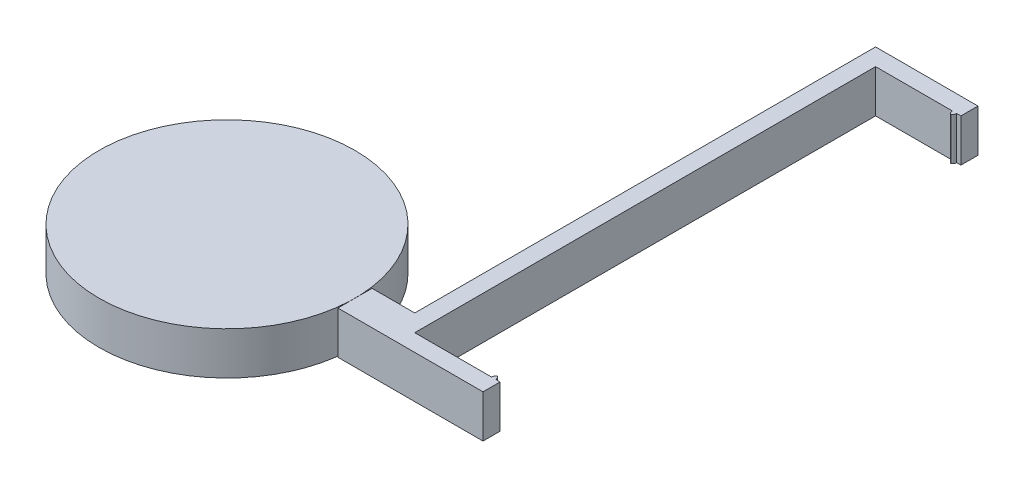
ISO-10303-21;
HEADER;
FILE_DESCRIPTION(('STEP AP214'),'2;1');
FILE_NAME('part.step','',(''),(''),'','','');
FILE_SCHEMA(('AUTOMOTIVE_DESIGN { 1 0 10303 214 1 1 1 1 }'));
ENDSEC;
DATA;
#1=APPLICATION_CONTEXT('core data for automotive mechanical design processes');
#2=APPLICATION_PROTOCOL_DEFINITION('international standard','automotive_design',2000,#1);
#3=PRODUCT_CONTEXT('',#1,'mechanical');
#4=PRODUCT('Part','Part','',(#3));
#5=PRODUCT_RELATED_PRODUCT_CATEGORY('part','',(#4));
#6=PRODUCT_DEFINITION_FORMATION('','',#4);
#7=PRODUCT_DEFINITION_CONTEXT('part definition',#1,'design');
#8=PRODUCT_DEFINITION('design','',#6,#7);
#9=PRODUCT_DEFINITION_SHAPE('','',#8);
#10=(LENGTH_UNIT() NAMED_UNIT(*) SI_UNIT(.MILLI.,.METRE.));
#11=(NAMED_UNIT(*) PLANE_ANGLE_UNIT() SI_UNIT($,.RADIAN.));
#12=(NAMED_UNIT(*) SI_UNIT($,.STERADIAN.) SOLID_ANGLE_UNIT());
#13=UNCERTAINTY_MEASURE_WITH_UNIT(LENGTH_MEASURE(1.E-05),#10,'distance_accuracy_value','');
#14=(GEOMETRIC_REPRESENTATION_CONTEXT(3) GLOBAL_UNCERTAINTY_ASSIGNED_CONTEXT((#13)) GLOBAL_UNIT_ASSIGNED_CONTEXT((#10,
#11,#12)) REPRESENTATION_CONTEXT('',''));
#15=CARTESIAN_POINT('',(0.,0.,0.));
#16=DIRECTION('',(0.,0.,1.));
#17=DIRECTION('',(1.,0.,0.));
#18=AXIS2_PLACEMENT_3D('',#15,#16,#17);
#19=CARTESIAN_POINT('',(-20.,2.5,27.));
#20=DIRECTION('',(0.,-1.,0.));
#21=DIRECTION('',(0.,0.,-1.));
#22=AXIS2_PLACEMENT_3D('',#19,#20,#21);
#23=CYLINDRICAL_SURFACE('',#22,15.);
#24=CARTESIAN_POINT('',(-20.,2.5,27.));
#25=DIRECTION('',(0.,1.,0.));
#26=DIRECTION('',(0.,0.,1.));
#27=AXIS2_PLACEMENT_3D('',#24,#25,#26);
#28=CIRCLE('',#27,15.);
#29=CARTESIAN_POINT('',(-20.,2.5,42.));
#30=VERTEX_POINT('',#29);
#31=EDGE_CURVE('E11',#30,#30,#28,.T.);
#32=ORIENTED_EDGE('',*,*,#31,.F.);
#33=EDGE_LOOP('',(#32));
#34=FACE_BOUND('',#33,.T.);
#35=CARTESIAN_POINT('',(-20.,-2.5,27.));
#36=DIRECTION('',(0.,1.,0.));
#37=DIRECTION('',(0.,0.,1.));
#38=AXIS2_PLACEMENT_3D('',#35,#36,#37);
#39=CIRCLE('',#38,15.);
#40=CARTESIAN_POINT('',(-20.,-2.5,42.));
#41=VERTEX_POINT('',#40);
#42=EDGE_CURVE('E55',#41,#41,#39,.T.);
#43=ORIENTED_EDGE('',*,*,#42,.T.);
#44=EDGE_LOOP('',(#43));
#45=FACE_BOUND('',#44,.T.);
#46=ADVANCED_FACE('F49',(#34,#45),#23,.T.);
#47=CARTESIAN_POINT('',(-20.,2.5,27.));
#48=DIRECTION('',(0.,1.,0.));
#49=DIRECTION('',(0.,0.,1.));
#50=AXIS2_PLACEMENT_3D('',#47,#48,#49);
#51=PLANE('',#50);
#52=ORIENTED_EDGE('',*,*,#31,.T.);
#53=EDGE_LOOP('',(#52));
#54=FACE_BOUND('',#53,.T.);
#55=ADVANCED_FACE('F64',(#54),#51,.T.);
#56=CARTESIAN_POINT('',(-20.,-2.5,27.));
#57=DIRECTION('',(0.,1.,0.));
#58=DIRECTION('',(0.,0.,1.));
#59=AXIS2_PLACEMENT_3D('',#56,#57,#58);
#60=PLANE('',#59);
#61=ORIENTED_EDGE('',*,*,#42,.F.);
#62=EDGE_LOOP('',(#61));
#63=FACE_BOUND('',#62,.T.);
#64=ADVANCED_FACE('F62',(#63),#60,.F.);
#65=CLOSED_SHELL('',(#46,#55,#64));
#66=MANIFOLD_SOLID_BREP('B2',#65);
#67=CARTESIAN_POINT('',(0.,0.,0.));
#68=DIRECTION('',(1.,0.,0.));
#69=DIRECTION('',(0.,0.,-1.));
#70=AXIS2_PLACEMENT_3D('',#67,#68,#69);
#71=PLANE('',#70);
#72=DIRECTION('',(0.,-1.,0.));
#73=VECTOR('',#72,1.);
#74=CARTESIAN_POINT('',(0.,2.5,25.));
#75=LINE('',#74,#73);
#76=CARTESIAN_POINT('',(0.,2.5,25.));
#77=VERTEX_POINT('',#76);
#78=CARTESIAN_POINT('',(0.,-2.5,25.));
#79=VERTEX_POINT('',#78);
#80=EDGE_CURVE('E109',#77,#79,#75,.T.);
#81=ORIENTED_EDGE('',*,*,#80,.F.);
#82=DIRECTION('',(0.,0.,1.));
#83=VECTOR('',#82,1.);
#84=CARTESIAN_POINT('',(0.,2.5,29.));
#85=LINE('',#84,#83);
#86=CARTESIAN_POINT('',(0.,2.5,-29.));
#87=VERTEX_POINT('',#86);
#88=EDGE_CURVE('E299',#87,#77,#85,.T.);
#89=ORIENTED_EDGE('',*,*,#88,.F.);
#90=DIRECTION('',(0.,1.,0.));
#91=VECTOR('',#90,1.);
#92=CARTESIAN_POINT('',(0.,2.5,-29.));
#93=LINE('',#92,#91);
#94=CARTESIAN_POINT('',(0.,-2.5,-29.));
#95=VERTEX_POINT('',#94);
#96=EDGE_CURVE('E270',#95,#87,#93,.T.);
#97=ORIENTED_EDGE('',*,*,#96,.F.);
#98=DIRECTION('',(0.,0.,-1.));
#99=VECTOR('',#98,1.);
#100=CARTESIAN_POINT('',(0.,-2.5,29.));
#101=LINE('',#100,#99);
#102=EDGE_CURVE('E286',#79,#95,#101,.T.);
#103=ORIENTED_EDGE('',*,*,#102,.F.);
#104=EDGE_LOOP('',(#81,#89,#97,#103));
#105=FACE_BOUND('',#104,.T.);
#106=ADVANCED_FACE('F93',(#105),#71,.F.);
#107=CARTESIAN_POINT('',(2.,2.5,27.));
#108=DIRECTION('',(0.,0.,1.));
#109=DIRECTION('',(1.,0.,0.));
#110=AXIS2_PLACEMENT_3D('',#107,#108,#109);
#111=PLANE('',#110);
#112=DIRECTION('',(1.,0.,0.));
#113=VECTOR('',#112,1.);
#114=CARTESIAN_POINT('',(2.,-2.5,27.));
#115=LINE('',#114,#113);
#116=CARTESIAN_POINT('',(11.5,-2.5,27.));
#117=VERTEX_POINT('',#116);
#118=CARTESIAN_POINT('',(12.,-2.5,27.));
#119=VERTEX_POINT('',#118);
#120=EDGE_CURVE('E274',#117,#119,#115,.T.);
#121=ORIENTED_EDGE('',*,*,#120,.F.);
#122=DIRECTION('',(0.,1.,0.));
#123=VECTOR('',#122,1.);
#124=CARTESIAN_POINT('',(11.5,2.5,27.));
#125=LINE('',#124,#123);
#126=CARTESIAN_POINT('',(11.5,2.5,27.));
#127=VERTEX_POINT('',#126);
#128=EDGE_CURVE('E232',#117,#127,#125,.T.);
#129=ORIENTED_EDGE('',*,*,#128,.T.);
#130=DIRECTION('',(1.,0.,0.));
#131=VECTOR('',#130,1.);
#132=CARTESIAN_POINT('',(2.,2.5,27.));
#133=LINE('',#132,#131);
#134=CARTESIAN_POINT('',(12.,2.5,27.));
#135=VERTEX_POINT('',#134);
#136=EDGE_CURVE('E278',#127,#135,#133,.T.);
#137=ORIENTED_EDGE('',*,*,#136,.T.);
#138=DIRECTION('',(0.,-1.,0.));
#139=VECTOR('',#138,1.);
#140=CARTESIAN_POINT('',(12.,2.5,27.));
#141=LINE('',#140,#139);
#142=EDGE_CURVE('E253',#135,#119,#141,.T.);
#143=ORIENTED_EDGE('',*,*,#142,.T.);
#144=EDGE_LOOP('',(#121,#129,#137,#143));
#145=FACE_BOUND('',#144,.T.);
#146=ADVANCED_FACE('F367',(#145),#111,.F.);
#147=CARTESIAN_POINT('',(2.,2.5,-27.));
#148=DIRECTION('',(0.,0.,-1.));
#149=DIRECTION('',(-1.,0.,0.));
#150=AXIS2_PLACEMENT_3D('',#147,#148,#149);
#151=PLANE('',#150);
#152=DIRECTION('',(0.,1.,0.));
#153=VECTOR('',#152,1.);
#154=CARTESIAN_POINT('',(11.5,2.5,-27.));
#155=LINE('',#154,#153);
#156=CARTESIAN_POINT('',(11.5,-2.5,-27.));
#157=VERTEX_POINT('',#156);
#158=CARTESIAN_POINT('',(11.5,2.5,-27.));
#159=VERTEX_POINT('',#158);
#160=EDGE_CURVE('E242',#157,#159,#155,.T.);
#161=ORIENTED_EDGE('',*,*,#160,.F.);
#162=DIRECTION('',(1.,0.,0.));
#163=VECTOR('',#162,1.);
#164=CARTESIAN_POINT('',(2.,-2.5,-27.));
#165=LINE('',#164,#163);
#166=CARTESIAN_POINT('',(12.,-2.5,-27.));
#167=VERTEX_POINT('',#166);
#168=EDGE_CURVE('E271',#157,#167,#165,.T.);
#169=ORIENTED_EDGE('',*,*,#168,.T.);
#170=DIRECTION('',(0.,1.,0.));
#171=VECTOR('',#170,1.);
#172=CARTESIAN_POINT('',(12.,2.5,-27.));
#173=LINE('',#172,#171);
#174=CARTESIAN_POINT('',(12.,2.5,-27.));
#175=VERTEX_POINT('',#174);
#176=EDGE_CURVE('E248',#167,#175,#173,.T.);
#177=ORIENTED_EDGE('',*,*,#176,.T.);
#178=DIRECTION('',(1.,0.,0.));
#179=VECTOR('',#178,1.);
#180=CARTESIAN_POINT('',(2.,2.5,-27.));
#181=LINE('',#180,#179);
#182=EDGE_CURVE('E262',#159,#175,#181,.T.);
#183=ORIENTED_EDGE('',*,*,#182,.F.);
#184=EDGE_LOOP('',(#161,#169,#177,#183));
#185=FACE_BOUND('',#184,.T.);
#186=ADVANCED_FACE('F355',(#185),#151,.F.);
#187=DIRECTION('',(0.,-1.,0.));
#188=VECTOR('',#187,1.);
#189=CARTESIAN_POINT('',(11.,2.5,-27.));
#190=LINE('',#189,#188);
#191=CARTESIAN_POINT('',(11.,2.5,-27.));
#192=VERTEX_POINT('',#191);
#193=CARTESIAN_POINT('',(11.,-2.5,-27.));
#194=VERTEX_POINT('',#193);
#195=EDGE_CURVE('E245',#192,#194,#190,.T.);
#196=ORIENTED_EDGE('',*,*,#195,.F.);
#197=CARTESIAN_POINT('',(2.,2.5,-27.));
#198=VERTEX_POINT('',#197);
#199=EDGE_CURVE('E279',#198,#192,#181,.T.);
#200=ORIENTED_EDGE('',*,*,#199,.F.);
#201=DIRECTION('',(0.,1.,0.));
#202=VECTOR('',#201,1.);
#203=CARTESIAN_POINT('',(2.,2.5,-27.));
#204=LINE('',#203,#202);
#205=CARTESIAN_POINT('',(2.,-2.5,-27.));
#206=VERTEX_POINT('',#205);
#207=EDGE_CURVE('E249',#206,#198,#204,.T.);
#208=ORIENTED_EDGE('',*,*,#207,.F.);
#209=EDGE_CURVE('E267',#206,#194,#165,.T.);
#210=ORIENTED_EDGE('',*,*,#209,.T.);
#211=EDGE_LOOP('',(#196,#200,#208,#210));
#212=FACE_BOUND('',#211,.T.);
#213=ADVANCED_FACE('F343',(#212),#151,.F.);
#214=CARTESIAN_POINT('',(12.,0.,0.));
#215=DIRECTION('',(1.,0.,0.));
#216=DIRECTION('',(0.,0.,-1.));
#217=AXIS2_PLACEMENT_3D('',#214,#215,#216);
#218=PLANE('',#217);
#219=ORIENTED_EDGE('',*,*,#176,.F.);
#220=DIRECTION('',(0.,0.,-1.));
#221=VECTOR('',#220,1.);
#222=CARTESIAN_POINT('',(12.,-2.5,29.));
#223=LINE('',#222,#221);
#224=CARTESIAN_POINT('',(12.,-2.5,-29.));
#225=VERTEX_POINT('',#224);
#226=EDGE_CURVE('E292',#167,#225,#223,.T.);
#227=ORIENTED_EDGE('',*,*,#226,.T.);
#228=DIRECTION('',(0.,1.,0.));
#229=VECTOR('',#228,1.);
#230=CARTESIAN_POINT('',(12.,2.5,-29.));
#231=LINE('',#230,#229);
#232=CARTESIAN_POINT('',(12.,2.5,-29.));
#233=VERTEX_POINT('',#232);
#234=EDGE_CURVE('E282',#225,#233,#231,.T.);
#235=ORIENTED_EDGE('',*,*,#234,.T.);
#236=DIRECTION('',(0.,0.,1.));
#237=VECTOR('',#236,1.);
#238=CARTESIAN_POINT('',(12.,2.5,29.));
#239=LINE('',#238,#237);
#240=EDGE_CURVE('E287',#233,#175,#239,.T.);
#241=ORIENTED_EDGE('',*,*,#240,.T.);
#242=EDGE_LOOP('',(#219,#227,#235,#241));
#243=FACE_BOUND('',#242,.T.);
#244=ADVANCED_FACE('F359',(#243),#218,.T.);
#245=CARTESIAN_POINT('',(12.,2.5,-29.));
#246=DIRECTION('',(0.,0.,1.));
#247=DIRECTION('',(1.,0.,0.));
#248=AXIS2_PLACEMENT_3D('',#245,#246,#247);
#249=PLANE('',#248);
#250=ORIENTED_EDGE('',*,*,#96,.T.);
#251=DIRECTION('',(-1.,0.,0.));
#252=VECTOR('',#251,1.);
#253=CARTESIAN_POINT('',(12.,2.5,-29.));
#254=LINE('',#253,#252);
#255=EDGE_CURVE('E307',#233,#87,#254,.T.);
#256=ORIENTED_EDGE('',*,*,#255,.F.);
#257=ORIENTED_EDGE('',*,*,#234,.F.);
#258=DIRECTION('',(-1.,0.,0.));
#259=VECTOR('',#258,1.);
#260=CARTESIAN_POINT('',(12.,-2.5,-29.));
#261=LINE('',#260,#259);
#262=EDGE_CURVE('E296',#225,#95,#261,.T.);
#263=ORIENTED_EDGE('',*,*,#262,.T.);
#264=EDGE_LOOP('',(#250,#256,#257,#263));
#265=FACE_BOUND('',#264,.T.);
#266=ADVANCED_FACE('F364',(#265),#249,.F.);
#267=CARTESIAN_POINT('',(12.,2.5,29.));
#268=DIRECTION('',(0.,-1.,0.));
#269=DIRECTION('',(0.,0.,-1.));
#270=AXIS2_PLACEMENT_3D('',#267,#268,#269);
#271=PLANE('',#270);
#272=CARTESIAN_POINT('',(11.,2.5,27.));
#273=DIRECTION('',(0.,-1.,0.));
#274=DIRECTION('',(0.,0.,-1.));
#275=AXIS2_PLACEMENT_3D('',#272,#273,#274);
#276=CIRCLE('',#275,0.5);
#277=CARTESIAN_POINT('',(11.25,2.5,26.5669872981078));
#278=VERTEX_POINT('',#277);
#279=EDGE_CURVE('E102',#127,#278,#276,.F.);
#280=ORIENTED_EDGE('',*,*,#279,.T.);
#281=CARTESIAN_POINT('',(11.5,2.5,27.));
#282=DIRECTION('',(0.,-1.,0.));
#283=DIRECTION('',(0.,0.,-1.));
#284=AXIS2_PLACEMENT_3D('',#281,#282,#283);
#285=CIRCLE('',#284,0.5);
#286=CARTESIAN_POINT('',(11.,2.5,27.));
#287=VERTEX_POINT('',#286);
#288=EDGE_CURVE('E47',#278,#287,#285,.F.);
#289=ORIENTED_EDGE('',*,*,#288,.T.);
#290=CARTESIAN_POINT('',(2.,2.5,27.));
#291=VERTEX_POINT('',#290);
#292=EDGE_CURVE('E275',#291,#287,#133,.T.);
#293=ORIENTED_EDGE('',*,*,#292,.F.);
#294=DIRECTION('',(0.,0.,1.));
#295=VECTOR('',#294,1.);
#296=CARTESIAN_POINT('',(2.,2.5,27.));
#297=LINE('',#296,#295);
#298=EDGE_CURVE('E252',#198,#291,#297,.T.);
#299=ORIENTED_EDGE('',*,*,#298,.F.);
#300=ORIENTED_EDGE('',*,*,#199,.T.);
#301=CARTESIAN_POINT('',(11.5,2.5,-27.));
#302=DIRECTION('',(0.,-1.,0.));
#303=DIRECTION('',(0.,0.,-1.));
#304=AXIS2_PLACEMENT_3D('',#301,#302,#303);
#305=CIRCLE('',#304,0.5);
#306=CARTESIAN_POINT('',(11.25,2.5,-26.5669872981078));
#307=VERTEX_POINT('',#306);
#308=EDGE_CURVE('E316',#192,#307,#305,.F.);
#309=ORIENTED_EDGE('',*,*,#308,.T.);
#310=CARTESIAN_POINT('',(11.,2.5,-27.));
#311=DIRECTION('',(0.,-1.,0.));
#312=DIRECTION('',(0.,0.,-1.));
#313=AXIS2_PLACEMENT_3D('',#310,#311,#312);
#314=CIRCLE('',#313,0.5);
#315=EDGE_CURVE('E314',#307,#159,#314,.F.);
#316=ORIENTED_EDGE('',*,*,#315,.T.);
#317=ORIENTED_EDGE('',*,*,#182,.T.);
#318=ORIENTED_EDGE('',*,*,#240,.F.);
#319=ORIENTED_EDGE('',*,*,#255,.T.);
#320=ORIENTED_EDGE('',*,*,#88,.T.);
#321=DIRECTION('',(1.,0.,0.));
#322=VECTOR('',#321,1.);
#323=CARTESIAN_POINT('',(-5.,2.5,25.));
#324=LINE('',#323,#322);
#325=CARTESIAN_POINT('',(-5.,2.5,25.));
#326=VERTEX_POINT('',#325);
#327=EDGE_CURVE('E229',#326,#77,#324,.T.);
#328=ORIENTED_EDGE('',*,*,#327,.F.);
#329=DIRECTION('',(0.,0.,-1.));
#330=VECTOR('',#329,1.);
#331=CARTESIAN_POINT('',(-5.,2.5,29.));
#332=LINE('',#331,#330);
#333=CARTESIAN_POINT('',(-5.,2.5,29.));
#334=VERTEX_POINT('',#333);
#335=EDGE_CURVE('E223',#334,#326,#332,.T.);
#336=ORIENTED_EDGE('',*,*,#335,.F.);
#337=DIRECTION('',(-1.,0.,0.));
#338=VECTOR('',#337,1.);
#339=CARTESIAN_POINT('',(12.,2.5,29.));
#340=LINE('',#339,#338);
#341=CARTESIAN_POINT('',(12.,2.5,29.));
#342=VERTEX_POINT('',#341);
#343=EDGE_CURVE('E305',#342,#334,#340,.T.);
#344=ORIENTED_EDGE('',*,*,#343,.F.);
#345=EDGE_CURVE('E285',#135,#342,#239,.T.);
#346=ORIENTED_EDGE('',*,*,#345,.F.);
#347=ORIENTED_EDGE('',*,*,#136,.F.);
#348=EDGE_LOOP('',(#280,#289,#293,#299,#300,#309,#316,#317,#318,#319,#320,#328,#336,#344,#346,#347));
#349=FACE_BOUND('',#348,.T.);
#350=ADVANCED_FACE('F334',(#349),#271,.F.);
#351=CARTESIAN_POINT('',(12.,2.5,29.));
#352=DIRECTION('',(0.,0.,-1.));
#353=DIRECTION('',(-1.,0.,0.));
#354=AXIS2_PLACEMENT_3D('',#351,#352,#353);
#355=PLANE('',#354);
#356=ORIENTED_EDGE('',*,*,#343,.T.);
#357=DIRECTION('',(0.,1.,0.));
#358=VECTOR('',#357,1.);
#359=CARTESIAN_POINT('',(-5.,2.5,29.));
#360=LINE('',#359,#358);
#361=CARTESIAN_POINT('',(-5.,-2.5,29.));
#362=VERTEX_POINT('',#361);
#363=EDGE_CURVE('E217',#362,#334,#360,.T.);
#364=ORIENTED_EDGE('',*,*,#363,.F.);
#365=DIRECTION('',(-1.,0.,0.));
#366=VECTOR('',#365,1.);
#367=CARTESIAN_POINT('',(12.,-2.5,29.));
#368=LINE('',#367,#366);
#369=CARTESIAN_POINT('',(12.,-2.5,29.));
#370=VERTEX_POINT('',#369);
#371=EDGE_CURVE('E213',#370,#362,#368,.T.);
#372=ORIENTED_EDGE('',*,*,#371,.F.);
#373=DIRECTION('',(0.,-1.,0.));
#374=VECTOR('',#373,1.);
#375=CARTESIAN_POINT('',(12.,2.5,29.));
#376=LINE('',#375,#374);
#377=EDGE_CURVE('E290',#342,#370,#376,.T.);
#378=ORIENTED_EDGE('',*,*,#377,.F.);
#379=EDGE_LOOP('',(#356,#364,#372,#378));
#380=FACE_BOUND('',#379,.T.);
#381=ADVANCED_FACE('F379',(#380),#355,.F.);
#382=CARTESIAN_POINT('',(12.,-2.5,29.));
#383=DIRECTION('',(0.,1.,0.));
#384=DIRECTION('',(0.,0.,1.));
#385=AXIS2_PLACEMENT_3D('',#382,#383,#384);
#386=PLANE('',#385);
#387=CARTESIAN_POINT('',(2.,-2.5,27.));
#388=VERTEX_POINT('',#387);
#389=CARTESIAN_POINT('',(11.,-2.5,27.));
#390=VERTEX_POINT('',#389);
#391=EDGE_CURVE('E272',#388,#390,#115,.T.);
#392=ORIENTED_EDGE('',*,*,#391,.T.);
#393=CARTESIAN_POINT('',(11.5,-2.5,27.));
#394=DIRECTION('',(0.,1.,0.));
#395=DIRECTION('',(0.,0.,1.));
#396=AXIS2_PLACEMENT_3D('',#393,#394,#395);
#397=CIRCLE('',#396,0.5);
#398=CARTESIAN_POINT('',(11.25,-2.5,26.5669872981078));
#399=VERTEX_POINT('',#398);
#400=EDGE_CURVE('E322',#390,#399,#397,.F.);
#401=ORIENTED_EDGE('',*,*,#400,.T.);
#402=CARTESIAN_POINT('',(11.,-2.5,27.));
#403=DIRECTION('',(0.,1.,0.));
#404=DIRECTION('',(0.,0.,1.));
#405=AXIS2_PLACEMENT_3D('',#402,#403,#404);
#406=CIRCLE('',#405,0.5);
#407=EDGE_CURVE('E318',#399,#117,#406,.F.);
#408=ORIENTED_EDGE('',*,*,#407,.T.);
#409=ORIENTED_EDGE('',*,*,#120,.T.);
#410=EDGE_CURVE('E293',#370,#119,#223,.T.);
#411=ORIENTED_EDGE('',*,*,#410,.F.);
#412=ORIENTED_EDGE('',*,*,#371,.T.);
#413=DIRECTION('',(0.,0.,1.));
#414=VECTOR('',#413,1.);
#415=CARTESIAN_POINT('',(-5.,-2.5,29.));
#416=LINE('',#415,#414);
#417=CARTESIAN_POINT('',(-5.,-2.5,25.));
#418=VERTEX_POINT('',#417);
#419=EDGE_CURVE('E205',#418,#362,#416,.T.);
#420=ORIENTED_EDGE('',*,*,#419,.F.);
#421=DIRECTION('',(1.,0.,0.));
#422=VECTOR('',#421,1.);
#423=CARTESIAN_POINT('',(-5.,-2.5,25.));
#424=LINE('',#423,#422);
#425=EDGE_CURVE('E210',#418,#79,#424,.T.);
#426=ORIENTED_EDGE('',*,*,#425,.T.);
#427=ORIENTED_EDGE('',*,*,#102,.T.);
#428=ORIENTED_EDGE('',*,*,#262,.F.);
#429=ORIENTED_EDGE('',*,*,#226,.F.);
#430=ORIENTED_EDGE('',*,*,#168,.F.);
#431=CARTESIAN_POINT('',(11.,-2.5,-27.));
#432=DIRECTION('',(0.,1.,0.));
#433=DIRECTION('',(0.,0.,1.));
#434=AXIS2_PLACEMENT_3D('',#431,#432,#433);
#435=CIRCLE('',#434,0.5);
#436=CARTESIAN_POINT('',(11.25,-2.5,-26.5669872981078));
#437=VERTEX_POINT('',#436);
#438=EDGE_CURVE('E310',#157,#437,#435,.F.);
#439=ORIENTED_EDGE('',*,*,#438,.T.);
#440=CARTESIAN_POINT('',(11.5,-2.5,-27.));
#441=DIRECTION('',(0.,1.,0.));
#442=DIRECTION('',(0.,0.,1.));
#443=AXIS2_PLACEMENT_3D('',#440,#441,#442);
#444=CIRCLE('',#443,0.5);
#445=EDGE_CURVE('E312',#437,#194,#444,.F.);
#446=ORIENTED_EDGE('',*,*,#445,.T.);
#447=ORIENTED_EDGE('',*,*,#209,.F.);
#448=DIRECTION('',(0.,0.,-1.));
#449=VECTOR('',#448,1.);
#450=CARTESIAN_POINT('',(2.,-2.5,27.));
#451=LINE('',#450,#449);
#452=EDGE_CURVE('E259',#388,#206,#451,.T.);
#453=ORIENTED_EDGE('',*,*,#452,.F.);
#454=EDGE_LOOP('',(#392,#401,#408,#409,#411,#412,#420,#426,#427,#428,#429,#430,#439,#446,#447,#453));
#455=FACE_BOUND('',#454,.T.);
#456=ADVANCED_FACE('F208',(#455),#386,.F.);
#457=ORIENTED_EDGE('',*,*,#142,.F.);
#458=ORIENTED_EDGE('',*,*,#345,.T.);
#459=ORIENTED_EDGE('',*,*,#377,.T.);
#460=ORIENTED_EDGE('',*,*,#410,.T.);
#461=EDGE_LOOP('',(#457,#458,#459,#460));
#462=FACE_BOUND('',#461,.T.);
#463=ADVANCED_FACE('F375',(#462),#218,.T.);
#464=ORIENTED_EDGE('',*,*,#292,.T.);
#465=DIRECTION('',(0.,-1.,0.));
#466=VECTOR('',#465,1.);
#467=CARTESIAN_POINT('',(11.,2.5,27.));
#468=LINE('',#467,#466);
#469=EDGE_CURVE('E238',#287,#390,#468,.T.);
#470=ORIENTED_EDGE('',*,*,#469,.T.);
#471=ORIENTED_EDGE('',*,*,#391,.F.);
#472=DIRECTION('',(0.,-1.,0.));
#473=VECTOR('',#472,1.);
#474=CARTESIAN_POINT('',(2.,2.5,27.));
#475=LINE('',#474,#473);
#476=EDGE_CURVE('E256',#291,#388,#475,.T.);
#477=ORIENTED_EDGE('',*,*,#476,.F.);
#478=EDGE_LOOP('',(#464,#470,#471,#477));
#479=FACE_BOUND('',#478,.T.);
#480=ADVANCED_FACE('F337',(#479),#111,.F.);
#481=CARTESIAN_POINT('',(2.,0.,0.));
#482=DIRECTION('',(1.,0.,0.));
#483=DIRECTION('',(0.,0.,-1.));
#484=AXIS2_PLACEMENT_3D('',#481,#482,#483);
#485=PLANE('',#484);
#486=ORIENTED_EDGE('',*,*,#207,.T.);
#487=ORIENTED_EDGE('',*,*,#298,.T.);
#488=ORIENTED_EDGE('',*,*,#476,.T.);
#489=ORIENTED_EDGE('',*,*,#452,.T.);
#490=EDGE_LOOP('',(#486,#487,#488,#489));
#491=FACE_BOUND('',#490,.T.);
#492=ADVANCED_FACE('F339',(#491),#485,.T.);
#493=CARTESIAN_POINT('',(11.,0.,-27.));
#494=DIRECTION('',(0.,-1.,0.));
#495=DIRECTION('',(0.,0.,-1.));
#496=AXIS2_PLACEMENT_3D('',#493,#494,#495);
#497=CYLINDRICAL_SURFACE('',#496,0.5);
#498=ORIENTED_EDGE('',*,*,#160,.T.);
#499=ORIENTED_EDGE('',*,*,#315,.F.);
#500=DIRECTION('',(0.,-1.,0.));
#501=VECTOR('',#500,1.);
#502=CARTESIAN_POINT('',(11.25,0.,-26.5669872981078));
#503=LINE('',#502,#501);
#504=EDGE_CURVE('E241',#437,#307,#503,.F.);
#505=ORIENTED_EDGE('',*,*,#504,.F.);
#506=ORIENTED_EDGE('',*,*,#438,.F.);
#507=EDGE_LOOP('',(#498,#499,#505,#506));
#508=FACE_BOUND('',#507,.T.);
#509=ADVANCED_FACE('F351',(#508),#497,.T.);
#510=CARTESIAN_POINT('',(11.5,0.,-27.));
#511=DIRECTION('',(0.,1.,0.));
#512=DIRECTION('',(0.,0.,1.));
#513=AXIS2_PLACEMENT_3D('',#510,#511,#512);
#514=CYLINDRICAL_SURFACE('',#513,0.5);
#515=ORIENTED_EDGE('',*,*,#308,.F.);
#516=ORIENTED_EDGE('',*,*,#195,.T.);
#517=ORIENTED_EDGE('',*,*,#445,.F.);
#518=ORIENTED_EDGE('',*,*,#504,.T.);
#519=EDGE_LOOP('',(#515,#516,#517,#518));
#520=FACE_BOUND('',#519,.T.);
#521=ADVANCED_FACE('F347',(#520),#514,.T.);
#522=CARTESIAN_POINT('',(11.,2.5,27.));
#523=DIRECTION('',(0.,1.,0.));
#524=DIRECTION('',(0.,0.,1.));
#525=AXIS2_PLACEMENT_3D('',#522,#523,#524);
#526=CYLINDRICAL_SURFACE('',#525,0.5);
#527=DIRECTION('',(0.,1.,0.));
#528=VECTOR('',#527,1.);
#529=CARTESIAN_POINT('',(11.25,0.,26.5669872981078));
#530=LINE('',#529,#528);
#531=EDGE_CURVE('E97',#278,#399,#530,.F.);
#532=ORIENTED_EDGE('',*,*,#531,.F.);
#533=ORIENTED_EDGE('',*,*,#279,.F.);
#534=ORIENTED_EDGE('',*,*,#128,.F.);
#535=ORIENTED_EDGE('',*,*,#407,.F.);
#536=EDGE_LOOP('',(#532,#533,#534,#535));
#537=FACE_BOUND('',#536,.T.);
#538=ADVANCED_FACE('F95',(#537),#526,.T.);
#539=CARTESIAN_POINT('',(11.5,2.5,27.));
#540=DIRECTION('',(0.,-1.,0.));
#541=DIRECTION('',(0.,0.,-1.));
#542=AXIS2_PLACEMENT_3D('',#539,#540,#541);
#543=CYLINDRICAL_SURFACE('',#542,0.5);
#544=ORIENTED_EDGE('',*,*,#288,.F.);
#545=ORIENTED_EDGE('',*,*,#531,.T.);
#546=ORIENTED_EDGE('',*,*,#400,.F.);
#547=ORIENTED_EDGE('',*,*,#469,.F.);
#548=EDGE_LOOP('',(#544,#545,#546,#547));
#549=FACE_BOUND('',#548,.T.);
#550=ADVANCED_FACE('F332',(#549),#543,.T.);
#551=CARTESIAN_POINT('',(-5.,2.5,25.));
#552=DIRECTION('',(0.,0.,1.));
#553=DIRECTION('',(0.,-1.,0.));
#554=AXIS2_PLACEMENT_3D('',#551,#552,#553);
#555=PLANE('',#554);
#556=ORIENTED_EDGE('',*,*,#80,.T.);
#557=ORIENTED_EDGE('',*,*,#425,.F.);
#558=DIRECTION('',(0.,-1.,0.));
#559=VECTOR('',#558,1.);
#560=CARTESIAN_POINT('',(-5.,2.5,25.));
#561=LINE('',#560,#559);
#562=EDGE_CURVE('E218',#326,#418,#561,.T.);
#563=ORIENTED_EDGE('',*,*,#562,.F.);
#564=ORIENTED_EDGE('',*,*,#327,.T.);
#565=EDGE_LOOP('',(#556,#557,#563,#564));
#566=FACE_BOUND('',#565,.T.);
#567=ADVANCED_FACE('F228',(#566),#555,.F.);
#568=CARTESIAN_POINT('',(-5.,0.,0.));
#569=DIRECTION('',(1.,0.,0.));
#570=DIRECTION('',(0.,0.,-1.));
#571=AXIS2_PLACEMENT_3D('',#568,#569,#570);
#572=PLANE('',#571);
#573=ORIENTED_EDGE('',*,*,#562,.T.);
#574=ORIENTED_EDGE('',*,*,#419,.T.);
#575=ORIENTED_EDGE('',*,*,#363,.T.);
#576=ORIENTED_EDGE('',*,*,#335,.T.);
#577=EDGE_LOOP('',(#573,#574,#575,#576));
#578=FACE_BOUND('',#577,.T.);
#579=ADVANCED_FACE('F221',(#578),#572,.F.);
#580=CLOSED_SHELL('',(#106,#146,#186,#213,#244,#266,#350,#381,#456,#463,#480,#492,#509,#521,
#538,#550,#567,#579));
#581=MANIFOLD_SOLID_BREP('B6',#580);
#582=ADVANCED_BREP_SHAPE_REPRESENTATION('',(#18,#66,#581),#14);
#583=SHAPE_DEFINITION_REPRESENTATION(#9,#582);
ENDSEC;
END-ISO-10303-21;
